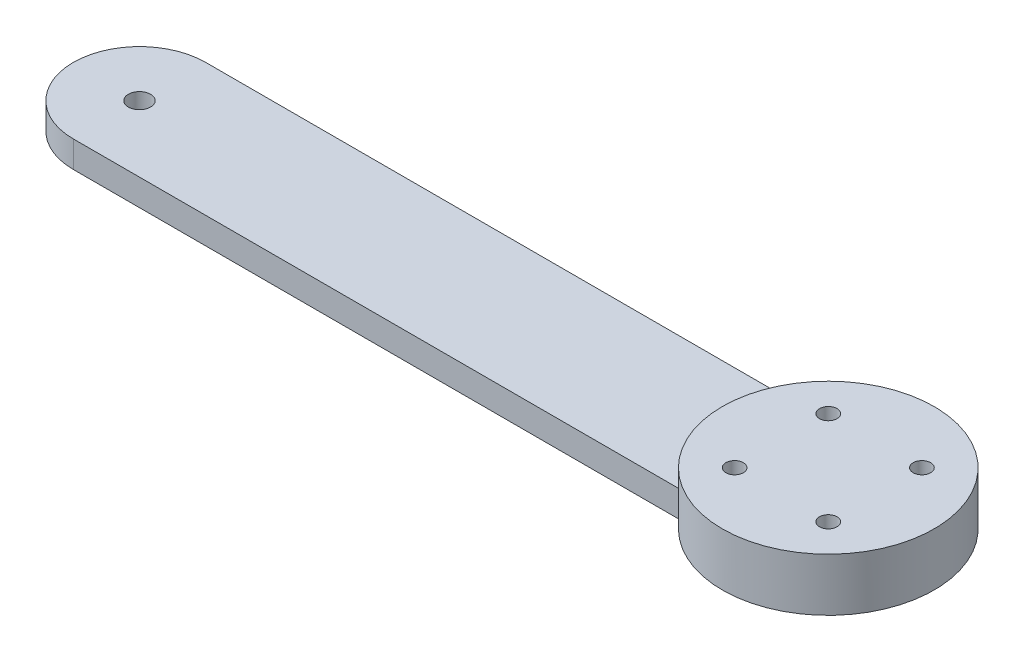
ISO-10303-21;
HEADER;
FILE_DESCRIPTION(('STEP AP214'),'2;1');
FILE_NAME('part.step','',(''),(''),'','','');
FILE_SCHEMA(('AUTOMOTIVE_DESIGN { 1 0 10303 214 1 1 1 1 }'));
ENDSEC;
DATA;
#1=APPLICATION_CONTEXT('core data for automotive mechanical design processes');
#2=APPLICATION_PROTOCOL_DEFINITION('international standard','automotive_design',2000,#1);
#3=PRODUCT_CONTEXT('',#1,'mechanical');
#4=PRODUCT('Part','Part','',(#3));
#5=PRODUCT_RELATED_PRODUCT_CATEGORY('part','',(#4));
#6=PRODUCT_DEFINITION_FORMATION('','',#4);
#7=PRODUCT_DEFINITION_CONTEXT('part definition',#1,'design');
#8=PRODUCT_DEFINITION('design','',#6,#7);
#9=PRODUCT_DEFINITION_SHAPE('','',#8);
#10=(LENGTH_UNIT() NAMED_UNIT(*) SI_UNIT(.MILLI.,.METRE.));
#11=(NAMED_UNIT(*) PLANE_ANGLE_UNIT() SI_UNIT($,.RADIAN.));
#12=(NAMED_UNIT(*) SI_UNIT($,.STERADIAN.) SOLID_ANGLE_UNIT());
#13=UNCERTAINTY_MEASURE_WITH_UNIT(LENGTH_MEASURE(1.E-05),#10,'distance_accuracy_value','');
#14=(GEOMETRIC_REPRESENTATION_CONTEXT(3) GLOBAL_UNCERTAINTY_ASSIGNED_CONTEXT((#13)) GLOBAL_UNIT_ASSIGNED_CONTEXT((#10,
#11,#12)) REPRESENTATION_CONTEXT('',''));
#15=CARTESIAN_POINT('',(0.,0.,0.));
#16=DIRECTION('',(0.,0.,1.));
#17=DIRECTION('',(1.,0.,0.));
#18=AXIS2_PLACEMENT_3D('',#15,#16,#17);
#19=CARTESIAN_POINT('',(-65.,5.,12.5));
#20=DIRECTION('',(0.,0.,-1.));
#21=DIRECTION('',(-1.,0.,0.));
#22=AXIS2_PLACEMENT_3D('',#19,#20,#21);
#23=PLANE('',#22);
#24=DIRECTION('',(0.,-1.,0.));
#25=VECTOR('',#24,1.);
#26=CARTESIAN_POINT('',(49.387505004004,10.,12.5));
#27=LINE('',#26,#25);
#28=CARTESIAN_POINT('',(49.387505004004,5.,12.5));
#29=VERTEX_POINT('',#28);
#30=CARTESIAN_POINT('',(49.387505004004,0.,12.5));
#31=VERTEX_POINT('',#30);
#32=EDGE_CURVE('E88',#29,#31,#27,.T.);
#33=ORIENTED_EDGE('',*,*,#32,.F.);
#34=DIRECTION('',(1.,0.,0.));
#35=VECTOR('',#34,1.);
#36=CARTESIAN_POINT('',(-65.,5.,12.5));
#37=LINE('',#36,#35);
#38=CARTESIAN_POINT('',(-65.,5.,12.5));
#39=VERTEX_POINT('',#38);
#40=EDGE_CURVE('E95',#39,#29,#37,.T.);
#41=ORIENTED_EDGE('',*,*,#40,.F.);
#42=DIRECTION('',(0.,-1.,0.));
#43=VECTOR('',#42,1.);
#44=CARTESIAN_POINT('',(-65.,5.,12.5));
#45=LINE('',#44,#43);
#46=CARTESIAN_POINT('',(-65.,0.,12.5));
#47=VERTEX_POINT('',#46);
#48=EDGE_CURVE('E11',#39,#47,#45,.T.);
#49=ORIENTED_EDGE('',*,*,#48,.T.);
#50=DIRECTION('',(1.,0.,0.));
#51=VECTOR('',#50,1.);
#52=CARTESIAN_POINT('',(-65.,0.,12.5));
#53=LINE('',#52,#51);
#54=EDGE_CURVE('E80',#47,#31,#53,.T.);
#55=ORIENTED_EDGE('',*,*,#54,.T.);
#56=EDGE_LOOP('',(#33,#41,#49,#55));
#57=FACE_BOUND('',#56,.T.);
#58=ADVANCED_FACE('F35',(#57),#23,.F.);
#59=CARTESIAN_POINT('',(-65.,5.,-12.5));
#60=DIRECTION('',(0.,0.,1.));
#61=DIRECTION('',(1.,0.,0.));
#62=AXIS2_PLACEMENT_3D('',#59,#60,#61);
#63=PLANE('',#62);
#64=DIRECTION('',(0.,-1.,0.));
#65=VECTOR('',#64,1.);
#66=CARTESIAN_POINT('',(49.387505004004,10.,-12.5));
#67=LINE('',#66,#65);
#68=CARTESIAN_POINT('',(49.387505004004,0.,-12.5));
#69=VERTEX_POINT('',#68);
#70=CARTESIAN_POINT('',(49.387505004004,5.,-12.5));
#71=VERTEX_POINT('',#70);
#72=EDGE_CURVE('E50',#69,#71,#67,.F.);
#73=ORIENTED_EDGE('',*,*,#72,.F.);
#74=DIRECTION('',(-1.,0.,0.));
#75=VECTOR('',#74,1.);
#76=CARTESIAN_POINT('',(-65.,0.,-12.5));
#77=LINE('',#76,#75);
#78=CARTESIAN_POINT('',(-65.,0.,-12.5));
#79=VERTEX_POINT('',#78);
#80=EDGE_CURVE('E71',#69,#79,#77,.T.);
#81=ORIENTED_EDGE('',*,*,#80,.T.);
#82=DIRECTION('',(0.,-1.,0.));
#83=VECTOR('',#82,1.);
#84=CARTESIAN_POINT('',(-65.,5.,-12.5));
#85=LINE('',#84,#83);
#86=CARTESIAN_POINT('',(-65.,5.,-12.5));
#87=VERTEX_POINT('',#86);
#88=EDGE_CURVE('E43',#87,#79,#85,.T.);
#89=ORIENTED_EDGE('',*,*,#88,.F.);
#90=DIRECTION('',(-1.,0.,0.));
#91=VECTOR('',#90,1.);
#92=CARTESIAN_POINT('',(-65.,5.,-12.5));
#93=LINE('',#92,#91);
#94=EDGE_CURVE('E58',#71,#87,#93,.T.);
#95=ORIENTED_EDGE('',*,*,#94,.F.);
#96=EDGE_LOOP('',(#73,#81,#89,#95));
#97=FACE_BOUND('',#96,.T.);
#98=ADVANCED_FACE('F73',(#97),#63,.F.);
#99=CARTESIAN_POINT('',(-65.,5.,0.));
#100=DIRECTION('',(0.,-1.,0.));
#101=DIRECTION('',(0.,0.,-1.));
#102=AXIS2_PLACEMENT_3D('',#99,#100,#101);
#103=CYLINDRICAL_SURFACE('',#102,12.5);
#104=CARTESIAN_POINT('',(-65.,0.,0.));
#105=DIRECTION('',(0.,1.,0.));
#106=DIRECTION('',(0.,0.,1.));
#107=AXIS2_PLACEMENT_3D('',#104,#105,#106);
#108=CIRCLE('',#107,12.5);
#109=EDGE_CURVE('E85',#79,#47,#108,.T.);
#110=ORIENTED_EDGE('',*,*,#109,.T.);
#111=ORIENTED_EDGE('',*,*,#48,.F.);
#112=CARTESIAN_POINT('',(-65.,5.,0.));
#113=DIRECTION('',(0.,1.,0.));
#114=DIRECTION('',(0.,0.,1.));
#115=AXIS2_PLACEMENT_3D('',#112,#113,#114);
#116=CIRCLE('',#115,12.5);
#117=EDGE_CURVE('E79',#87,#39,#116,.T.);
#118=ORIENTED_EDGE('',*,*,#117,.F.);
#119=ORIENTED_EDGE('',*,*,#88,.T.);
#120=EDGE_LOOP('',(#110,#111,#118,#119));
#121=FACE_BOUND('',#120,.T.);
#122=ADVANCED_FACE('F37',(#121),#103,.T.);
#123=CARTESIAN_POINT('',(-65.,5.,0.));
#124=DIRECTION('',(0.,1.,0.));
#125=DIRECTION('',(0.,0.,1.));
#126=AXIS2_PLACEMENT_3D('',#123,#124,#125);
#127=PLANE('',#126);
#128=CARTESIAN_POINT('',(-65.,5.,0.));
#129=DIRECTION('',(0.,1.,0.));
#130=DIRECTION('',(0.,0.,1.));
#131=AXIS2_PLACEMENT_3D('',#128,#129,#130);
#132=CIRCLE('',#131,2.1);
#133=CARTESIAN_POINT('',(-65.,5.,2.1));
#134=VERTEX_POINT('',#133);
#135=EDGE_CURVE('E134',#134,#134,#132,.T.);
#136=ORIENTED_EDGE('',*,*,#135,.F.);
#137=EDGE_LOOP('',(#136));
#138=FACE_BOUND('',#137,.T.);
#139=ORIENTED_EDGE('',*,*,#40,.T.);
#140=CARTESIAN_POINT('',(65.,5.,0.));
#141=DIRECTION('',(0.,1.,0.));
#142=DIRECTION('',(0.,0.,1.));
#143=AXIS2_PLACEMENT_3D('',#140,#141,#142);
#144=CIRCLE('',#143,20.);
#145=EDGE_CURVE('E100',#29,#71,#144,.F.);
#146=ORIENTED_EDGE('',*,*,#145,.T.);
#147=ORIENTED_EDGE('',*,*,#94,.T.);
#148=ORIENTED_EDGE('',*,*,#117,.T.);
#149=EDGE_LOOP('',(#139,#146,#147,#148));
#150=FACE_BOUND('',#149,.T.);
#151=ADVANCED_FACE('F141',(#138,#150),#127,.T.);
#152=CARTESIAN_POINT('',(-65.,0.,0.));
#153=DIRECTION('',(0.,1.,0.));
#154=DIRECTION('',(0.,0.,1.));
#155=AXIS2_PLACEMENT_3D('',#152,#153,#154);
#156=PLANE('',#155);
#157=CARTESIAN_POINT('',(-65.,0.,0.));
#158=DIRECTION('',(0.,1.,0.));
#159=DIRECTION('',(0.,0.,1.));
#160=AXIS2_PLACEMENT_3D('',#157,#158,#159);
#161=CIRCLE('',#160,2.1);
#162=CARTESIAN_POINT('',(-65.,0.,2.1));
#163=VERTEX_POINT('',#162);
#164=EDGE_CURVE('E121',#163,#163,#161,.F.);
#165=ORIENTED_EDGE('',*,*,#164,.F.);
#166=EDGE_LOOP('',(#165));
#167=FACE_BOUND('',#166,.T.);
#168=CARTESIAN_POINT('',(56.1611652351682,0.,8.83883476483191));
#169=DIRECTION('',(0.,1.,0.));
#170=DIRECTION('',(0.,0.,1.));
#171=AXIS2_PLACEMENT_3D('',#168,#169,#170);
#172=CIRCLE('',#171,1.65);
#173=CARTESIAN_POINT('',(56.1611652351682,0.,10.4888347648319));
#174=VERTEX_POINT('',#173);
#175=EDGE_CURVE('E114',#174,#174,#172,.F.);
#176=ORIENTED_EDGE('',*,*,#175,.F.);
#177=EDGE_LOOP('',(#176));
#178=FACE_BOUND('',#177,.T.);
#179=CARTESIAN_POINT('',(73.8388347648319,0.,8.83883476483181));
#180=DIRECTION('',(0.,1.,0.));
#181=DIRECTION('',(0.,0.,1.));
#182=AXIS2_PLACEMENT_3D('',#179,#180,#181);
#183=CIRCLE('',#182,1.64999999999999);
#184=CARTESIAN_POINT('',(73.8388347648319,0.,10.4888347648318));
#185=VERTEX_POINT('',#184);
#186=EDGE_CURVE('E122',#185,#185,#183,.F.);
#187=ORIENTED_EDGE('',*,*,#186,.F.);
#188=EDGE_LOOP('',(#187));
#189=FACE_BOUND('',#188,.T.);
#190=CARTESIAN_POINT('',(73.8388347648318,0.,-8.8388347648319));
#191=DIRECTION('',(0.,1.,0.));
#192=DIRECTION('',(0.,0.,1.));
#193=AXIS2_PLACEMENT_3D('',#190,#191,#192);
#194=CIRCLE('',#193,1.65);
#195=CARTESIAN_POINT('',(73.8388347648318,0.,-7.18883476483189));
#196=VERTEX_POINT('',#195);
#197=EDGE_CURVE('E113',#196,#196,#194,.F.);
#198=ORIENTED_EDGE('',*,*,#197,.F.);
#199=EDGE_LOOP('',(#198));
#200=FACE_BOUND('',#199,.T.);
#201=CARTESIAN_POINT('',(56.1611652351681,0.,-8.8388347648318));
#202=DIRECTION('',(0.,1.,0.));
#203=DIRECTION('',(0.,0.,1.));
#204=AXIS2_PLACEMENT_3D('',#201,#202,#203);
#205=CIRCLE('',#204,1.65);
#206=CARTESIAN_POINT('',(56.1611652351681,0.,-7.1888347648318));
#207=VERTEX_POINT('',#206);
#208=EDGE_CURVE('E105',#207,#207,#205,.F.);
#209=ORIENTED_EDGE('',*,*,#208,.F.);
#210=EDGE_LOOP('',(#209));
#211=FACE_BOUND('',#210,.T.);
#212=ORIENTED_EDGE('',*,*,#80,.F.);
#213=CARTESIAN_POINT('',(65.,0.,0.));
#214=DIRECTION('',(0.,1.,0.));
#215=DIRECTION('',(0.,0.,1.));
#216=AXIS2_PLACEMENT_3D('',#213,#214,#215);
#217=CIRCLE('',#216,20.);
#218=EDGE_CURVE('E103',#31,#69,#217,.T.);
#219=ORIENTED_EDGE('',*,*,#218,.F.);
#220=ORIENTED_EDGE('',*,*,#54,.F.);
#221=ORIENTED_EDGE('',*,*,#109,.F.);
#222=EDGE_LOOP('',(#212,#219,#220,#221));
#223=FACE_BOUND('',#222,.T.);
#224=ADVANCED_FACE('F86',(#167,#178,#189,#200,#211,#223),#156,.F.);
#225=CARTESIAN_POINT('',(65.,10.,0.));
#226=DIRECTION('',(0.,-1.,0.));
#227=DIRECTION('',(0.,0.,-1.));
#228=AXIS2_PLACEMENT_3D('',#225,#226,#227);
#229=CYLINDRICAL_SURFACE('',#228,20.);
#230=CARTESIAN_POINT('',(65.,10.,0.));
#231=DIRECTION('',(0.,1.,0.));
#232=DIRECTION('',(0.,0.,1.));
#233=AXIS2_PLACEMENT_3D('',#230,#231,#232);
#234=CIRCLE('',#233,20.);
#235=CARTESIAN_POINT('',(65.,10.,20.));
#236=VERTEX_POINT('',#235);
#237=EDGE_CURVE('E102',#236,#236,#234,.T.);
#238=ORIENTED_EDGE('',*,*,#237,.F.);
#239=EDGE_LOOP('',(#238));
#240=FACE_BOUND('',#239,.T.);
#241=ORIENTED_EDGE('',*,*,#145,.F.);
#242=ORIENTED_EDGE('',*,*,#32,.T.);
#243=ORIENTED_EDGE('',*,*,#218,.T.);
#244=ORIENTED_EDGE('',*,*,#72,.T.);
#245=EDGE_LOOP('',(#241,#242,#243,#244));
#246=FACE_BOUND('',#245,.T.);
#247=ADVANCED_FACE('F147',(#240,#246),#229,.T.);
#248=CARTESIAN_POINT('',(65.,10.,0.));
#249=DIRECTION('',(0.,1.,0.));
#250=DIRECTION('',(0.,0.,1.));
#251=AXIS2_PLACEMENT_3D('',#248,#249,#250);
#252=PLANE('',#251);
#253=CARTESIAN_POINT('',(56.1611652351682,10.,8.83883476483191));
#254=DIRECTION('',(0.,1.,0.));
#255=DIRECTION('',(0.,0.,1.));
#256=AXIS2_PLACEMENT_3D('',#253,#254,#255);
#257=CIRCLE('',#256,1.65);
#258=CARTESIAN_POINT('',(56.1611652351682,10.,10.4888347648319));
#259=VERTEX_POINT('',#258);
#260=EDGE_CURVE('E118',#259,#259,#257,.T.);
#261=ORIENTED_EDGE('',*,*,#260,.F.);
#262=EDGE_LOOP('',(#261));
#263=FACE_BOUND('',#262,.T.);
#264=CARTESIAN_POINT('',(73.8388347648319,10.,8.83883476483181));
#265=DIRECTION('',(0.,1.,0.));
#266=DIRECTION('',(0.,0.,1.));
#267=AXIS2_PLACEMENT_3D('',#264,#265,#266);
#268=CIRCLE('',#267,1.64999999999999);
#269=CARTESIAN_POINT('',(73.8388347648319,10.,10.4888347648318));
#270=VERTEX_POINT('',#269);
#271=EDGE_CURVE('E117',#270,#270,#268,.T.);
#272=ORIENTED_EDGE('',*,*,#271,.F.);
#273=EDGE_LOOP('',(#272));
#274=FACE_BOUND('',#273,.T.);
#275=CARTESIAN_POINT('',(73.8388347648318,10.,-8.8388347648319));
#276=DIRECTION('',(0.,1.,0.));
#277=DIRECTION('',(0.,0.,1.));
#278=AXIS2_PLACEMENT_3D('',#275,#276,#277);
#279=CIRCLE('',#278,1.65);
#280=CARTESIAN_POINT('',(73.8388347648318,10.,-7.18883476483189));
#281=VERTEX_POINT('',#280);
#282=EDGE_CURVE('E125',#281,#281,#279,.T.);
#283=ORIENTED_EDGE('',*,*,#282,.F.);
#284=EDGE_LOOP('',(#283));
#285=FACE_BOUND('',#284,.T.);
#286=CARTESIAN_POINT('',(56.1611652351681,10.,-8.8388347648318));
#287=DIRECTION('',(0.,1.,0.));
#288=DIRECTION('',(0.,0.,1.));
#289=AXIS2_PLACEMENT_3D('',#286,#287,#288);
#290=CIRCLE('',#289,1.65);
#291=CARTESIAN_POINT('',(56.1611652351681,10.,-7.1888347648318));
#292=VERTEX_POINT('',#291);
#293=EDGE_CURVE('E110',#292,#292,#290,.T.);
#294=ORIENTED_EDGE('',*,*,#293,.F.);
#295=EDGE_LOOP('',(#294));
#296=FACE_BOUND('',#295,.T.);
#297=ORIENTED_EDGE('',*,*,#237,.T.);
#298=EDGE_LOOP('',(#297));
#299=FACE_BOUND('',#298,.T.);
#300=ADVANCED_FACE('F151',(#263,#274,#285,#296,#299),#252,.T.);
#301=CARTESIAN_POINT('',(56.1611652351681,-0.000999999999999265,-8.8388347648318));
#302=DIRECTION('',(0.,1.,0.));
#303=DIRECTION('',(0.,0.,1.));
#304=AXIS2_PLACEMENT_3D('',#301,#302,#303);
#305=CYLINDRICAL_SURFACE('',#304,1.65);
#306=ORIENTED_EDGE('',*,*,#293,.T.);
#307=EDGE_LOOP('',(#306));
#308=FACE_BOUND('',#307,.T.);
#309=ORIENTED_EDGE('',*,*,#208,.T.);
#310=EDGE_LOOP('',(#309));
#311=FACE_BOUND('',#310,.T.);
#312=ADVANCED_FACE('F158',(#308,#311),#305,.F.);
#313=CARTESIAN_POINT('',(73.8388347648318,-0.000999999999999265,-8.8388347648319));
#314=DIRECTION('',(0.,1.,0.));
#315=DIRECTION('',(0.,0.,1.));
#316=AXIS2_PLACEMENT_3D('',#313,#314,#315);
#317=CYLINDRICAL_SURFACE('',#316,1.65);
#318=ORIENTED_EDGE('',*,*,#282,.T.);
#319=EDGE_LOOP('',(#318));
#320=FACE_BOUND('',#319,.T.);
#321=ORIENTED_EDGE('',*,*,#197,.T.);
#322=EDGE_LOOP('',(#321));
#323=FACE_BOUND('',#322,.T.);
#324=ADVANCED_FACE('F212',(#320,#323),#317,.F.);
#325=CARTESIAN_POINT('',(73.8388347648319,-0.000999999999999265,8.83883476483181));
#326=DIRECTION('',(0.,1.,0.));
#327=DIRECTION('',(0.,0.,1.));
#328=AXIS2_PLACEMENT_3D('',#325,#326,#327);
#329=CYLINDRICAL_SURFACE('',#328,1.64999999999999);
#330=ORIENTED_EDGE('',*,*,#271,.T.);
#331=EDGE_LOOP('',(#330));
#332=FACE_BOUND('',#331,.T.);
#333=ORIENTED_EDGE('',*,*,#186,.T.);
#334=EDGE_LOOP('',(#333));
#335=FACE_BOUND('',#334,.T.);
#336=ADVANCED_FACE('F205',(#332,#335),#329,.F.);
#337=CARTESIAN_POINT('',(56.1611652351682,-0.000999999999999265,8.83883476483191));
#338=DIRECTION('',(0.,1.,0.));
#339=DIRECTION('',(0.,0.,1.));
#340=AXIS2_PLACEMENT_3D('',#337,#338,#339);
#341=CYLINDRICAL_SURFACE('',#340,1.65);
#342=ORIENTED_EDGE('',*,*,#260,.T.);
#343=EDGE_LOOP('',(#342));
#344=FACE_BOUND('',#343,.T.);
#345=ORIENTED_EDGE('',*,*,#175,.T.);
#346=EDGE_LOOP('',(#345));
#347=FACE_BOUND('',#346,.T.);
#348=ADVANCED_FACE('F196',(#344,#347),#341,.F.);
#349=CARTESIAN_POINT('',(-65.,-0.00100000000000013,0.));
#350=DIRECTION('',(0.,1.,0.));
#351=DIRECTION('',(0.,0.,1.));
#352=AXIS2_PLACEMENT_3D('',#349,#350,#351);
#353=CYLINDRICAL_SURFACE('',#352,2.1);
#354=ORIENTED_EDGE('',*,*,#135,.T.);
#355=EDGE_LOOP('',(#354));
#356=FACE_BOUND('',#355,.T.);
#357=ORIENTED_EDGE('',*,*,#164,.T.);
#358=EDGE_LOOP('',(#357));
#359=FACE_BOUND('',#358,.T.);
#360=ADVANCED_FACE('F138',(#356,#359),#353,.F.);
#361=CLOSED_SHELL('',(#58,#98,#122,#151,#224,#247,#300,#312,#324,#336,#348,#360));
#362=MANIFOLD_SOLID_BREP('B2',#361);
#363=ADVANCED_BREP_SHAPE_REPRESENTATION('',(#18,#362),#14);
#364=SHAPE_DEFINITION_REPRESENTATION(#9,#363);
ENDSEC;
END-ISO-10303-21;
